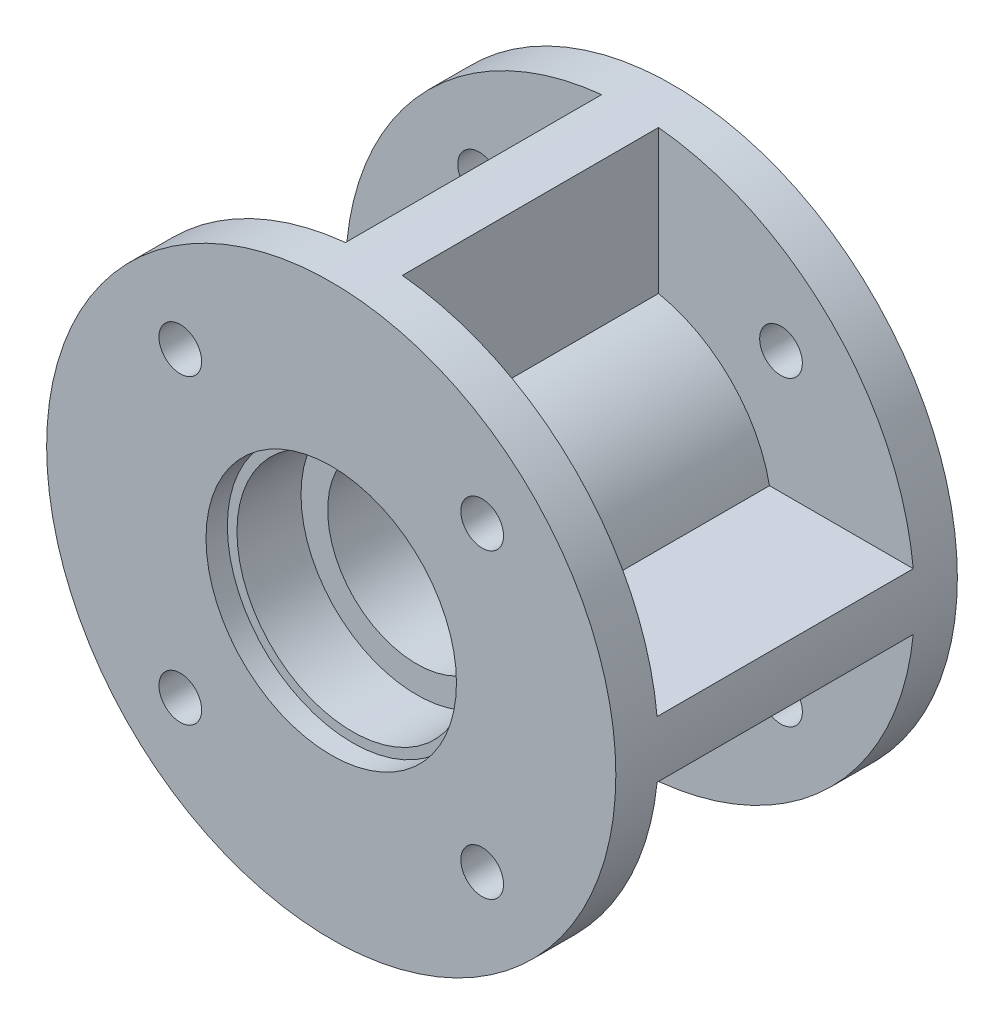
ISO-10303-21;
HEADER;
FILE_DESCRIPTION(('STEP AP214'),'2;1');
FILE_NAME('part.step','',(''),(''),'','','');
FILE_SCHEMA(('AUTOMOTIVE_DESIGN { 1 0 10303 214 1 1 1 1 }'));
ENDSEC;
DATA;
#1=APPLICATION_CONTEXT('core data for automotive mechanical design processes');
#2=APPLICATION_PROTOCOL_DEFINITION('international standard','automotive_design',2000,#1);
#3=PRODUCT_CONTEXT('',#1,'mechanical');
#4=PRODUCT('Part','Part','',(#3));
#5=PRODUCT_RELATED_PRODUCT_CATEGORY('part','',(#4));
#6=PRODUCT_DEFINITION_FORMATION('','',#4);
#7=PRODUCT_DEFINITION_CONTEXT('part definition',#1,'design');
#8=PRODUCT_DEFINITION('design','',#6,#7);
#9=PRODUCT_DEFINITION_SHAPE('','',#8);
#10=(LENGTH_UNIT() NAMED_UNIT(*) SI_UNIT(.MILLI.,.METRE.));
#11=(NAMED_UNIT(*) PLANE_ANGLE_UNIT() SI_UNIT($,.RADIAN.));
#12=(NAMED_UNIT(*) SI_UNIT($,.STERADIAN.) SOLID_ANGLE_UNIT());
#13=UNCERTAINTY_MEASURE_WITH_UNIT(LENGTH_MEASURE(1.E-05),#10,'distance_accuracy_value','');
#14=(GEOMETRIC_REPRESENTATION_CONTEXT(3) GLOBAL_UNCERTAINTY_ASSIGNED_CONTEXT((#13)) GLOBAL_UNIT_ASSIGNED_CONTEXT((#10,
#11,#12)) REPRESENTATION_CONTEXT('',''));
#15=CARTESIAN_POINT('',(0.,0.,0.));
#16=DIRECTION('',(0.,0.,1.));
#17=DIRECTION('',(1.,0.,0.));
#18=AXIS2_PLACEMENT_3D('',#15,#16,#17);
#19=CARTESIAN_POINT('',(0.,0.,36.));
#20=DIRECTION('',(0.,0.,-1.));
#21=DIRECTION('',(-1.,0.,0.));
#22=AXIS2_PLACEMENT_3D('',#19,#20,#21);
#23=CYLINDRICAL_SURFACE('',#22,20.);
#24=CARTESIAN_POINT('',(0.,0.,42.));
#25=DIRECTION('',(0.,0.,1.));
#26=DIRECTION('',(1.,0.,0.));
#27=AXIS2_PLACEMENT_3D('',#24,#25,#26);
#28=CIRCLE('',#27,20.);
#29=CARTESIAN_POINT('',(19.5959179422654,4.,42.));
#30=VERTEX_POINT('',#29);
#31=CARTESIAN_POINT('',(4.00000000000021,19.5959179422654,42.));
#32=VERTEX_POINT('',#31);
#33=EDGE_CURVE('E168',#30,#32,#28,.T.);
#34=ORIENTED_EDGE('',*,*,#33,.F.);
#35=DIRECTION('',(0.,0.,-1.));
#36=VECTOR('',#35,1.);
#37=CARTESIAN_POINT('',(19.5959179422654,4.,69.9163538166998));
#38=LINE('',#37,#36);
#39=CARTESIAN_POINT('',(19.5959179422654,4.,6.));
#40=VERTEX_POINT('',#39);
#41=EDGE_CURVE('E182',#30,#40,#38,.T.);
#42=ORIENTED_EDGE('',*,*,#41,.T.);
#43=CARTESIAN_POINT('',(0.,0.,6.));
#44=DIRECTION('',(0.,0.,1.));
#45=DIRECTION('',(1.,0.,0.));
#46=AXIS2_PLACEMENT_3D('',#43,#44,#45);
#47=CIRCLE('',#46,20.);
#48=CARTESIAN_POINT('',(4.00000000000021,19.5959179422654,6.));
#49=VERTEX_POINT('',#48);
#50=EDGE_CURVE('E254',#40,#49,#47,.T.);
#51=ORIENTED_EDGE('',*,*,#50,.T.);
#52=DIRECTION('',(0.,0.,-1.));
#53=VECTOR('',#52,1.);
#54=CARTESIAN_POINT('',(4.00000000000021,19.5959179422654,69.9163538166998));
#55=LINE('',#54,#53);
#56=EDGE_CURVE('E184',#32,#49,#55,.T.);
#57=ORIENTED_EDGE('',*,*,#56,.F.);
#58=EDGE_LOOP('',(#34,#42,#51,#57));
#59=FACE_BOUND('',#58,.T.);
#60=ADVANCED_FACE('F54',(#59),#23,.T.);
#61=CARTESIAN_POINT('',(-3.99999999999979,19.5959179422655,42.));
#62=VERTEX_POINT('',#61);
#63=CARTESIAN_POINT('',(-19.5959179422654,4.00000000000014,42.));
#64=VERTEX_POINT('',#63);
#65=EDGE_CURVE('E187',#62,#64,#28,.T.);
#66=ORIENTED_EDGE('',*,*,#65,.F.);
#67=DIRECTION('',(0.,0.,-1.));
#68=VECTOR('',#67,1.);
#69=CARTESIAN_POINT('',(-3.99999999999979,19.5959179422655,69.9163538166998));
#70=LINE('',#69,#68);
#71=CARTESIAN_POINT('',(-3.99999999999979,19.5959179422655,6.));
#72=VERTEX_POINT('',#71);
#73=EDGE_CURVE('E346',#62,#72,#70,.T.);
#74=ORIENTED_EDGE('',*,*,#73,.T.);
#75=CARTESIAN_POINT('',(-19.5959179422654,4.00000000000014,6.));
#76=VERTEX_POINT('',#75);
#77=EDGE_CURVE('E255',#72,#76,#47,.T.);
#78=ORIENTED_EDGE('',*,*,#77,.T.);
#79=DIRECTION('',(0.,0.,-1.));
#80=VECTOR('',#79,1.);
#81=CARTESIAN_POINT('',(-19.5959179422654,4.00000000000014,69.9163538166998));
#82=LINE('',#81,#80);
#83=EDGE_CURVE('E366',#64,#76,#82,.T.);
#84=ORIENTED_EDGE('',*,*,#83,.F.);
#85=EDGE_LOOP('',(#66,#74,#78,#84));
#86=FACE_BOUND('',#85,.T.);
#87=ADVANCED_FACE('F486',(#86),#23,.T.);
#88=CARTESIAN_POINT('',(-19.5959179422655,-3.99999999999986,42.));
#89=VERTEX_POINT('',#88);
#90=CARTESIAN_POINT('',(-4.00000000000007,-19.5959179422654,42.));
#91=VERTEX_POINT('',#90);
#92=EDGE_CURVE('E507',#89,#91,#28,.T.);
#93=ORIENTED_EDGE('',*,*,#92,.F.);
#94=DIRECTION('',(0.,0.,-1.));
#95=VECTOR('',#94,1.);
#96=CARTESIAN_POINT('',(-19.5959179422655,-3.99999999999986,69.9163538166998));
#97=LINE('',#96,#95);
#98=CARTESIAN_POINT('',(-19.5959179422655,-3.99999999999986,6.));
#99=VERTEX_POINT('',#98);
#100=EDGE_CURVE('E220',#89,#99,#97,.T.);
#101=ORIENTED_EDGE('',*,*,#100,.T.);
#102=CARTESIAN_POINT('',(-4.00000000000007,-19.5959179422654,6.));
#103=VERTEX_POINT('',#102);
#104=EDGE_CURVE('E248',#99,#103,#47,.T.);
#105=ORIENTED_EDGE('',*,*,#104,.T.);
#106=DIRECTION('',(0.,0.,-1.));
#107=VECTOR('',#106,1.);
#108=CARTESIAN_POINT('',(-4.00000000000007,-19.5959179422654,69.9163538166998));
#109=LINE('',#108,#107);
#110=EDGE_CURVE('E201',#91,#103,#109,.T.);
#111=ORIENTED_EDGE('',*,*,#110,.F.);
#112=EDGE_LOOP('',(#93,#101,#105,#111));
#113=FACE_BOUND('',#112,.T.);
#114=ADVANCED_FACE('F417',(#113),#23,.T.);
#115=CARTESIAN_POINT('',(3.99999999999993,-19.5959179422654,42.));
#116=VERTEX_POINT('',#115);
#117=CARTESIAN_POINT('',(19.5959179422654,-4.,42.));
#118=VERTEX_POINT('',#117);
#119=EDGE_CURVE('E189',#116,#118,#28,.T.);
#120=ORIENTED_EDGE('',*,*,#119,.F.);
#121=DIRECTION('',(0.,0.,-1.));
#122=VECTOR('',#121,1.);
#123=CARTESIAN_POINT('',(3.99999999999993,-19.5959179422654,69.9163538166998));
#124=LINE('',#123,#122);
#125=CARTESIAN_POINT('',(3.99999999999993,-19.5959179422654,6.));
#126=VERTEX_POINT('',#125);
#127=EDGE_CURVE('E195',#116,#126,#124,.T.);
#128=ORIENTED_EDGE('',*,*,#127,.T.);
#129=CARTESIAN_POINT('',(19.5959179422654,-4.,6.));
#130=VERTEX_POINT('',#129);
#131=EDGE_CURVE('E249',#126,#130,#47,.T.);
#132=ORIENTED_EDGE('',*,*,#131,.T.);
#133=DIRECTION('',(0.,0.,-1.));
#134=VECTOR('',#133,1.);
#135=CARTESIAN_POINT('',(19.5959179422654,-4.,69.9163538166998));
#136=LINE('',#135,#134);
#137=EDGE_CURVE('E196',#118,#130,#136,.T.);
#138=ORIENTED_EDGE('',*,*,#137,.F.);
#139=EDGE_LOOP('',(#120,#128,#132,#138));
#140=FACE_BOUND('',#139,.T.);
#141=ADVANCED_FACE('F488',(#140),#23,.T.);
#142=CARTESIAN_POINT('',(-4.00000000000007,-19.5959179422654,69.9163538166998));
#143=DIRECTION('',(1.,0.,0.));
#144=DIRECTION('',(0.,1.,0.));
#145=AXIS2_PLACEMENT_3D('',#142,#143,#144);
#146=PLANE('',#145);
#147=DIRECTION('',(0.,-1.,0.));
#148=VECTOR('',#147,1.);
#149=CARTESIAN_POINT('',(-4.00000000000007,-19.5959179422654,42.));
#150=LINE('',#149,#148);
#151=CARTESIAN_POINT('',(-4.00000000000014,-39.7994974842648,42.));
#152=VERTEX_POINT('',#151);
#153=EDGE_CURVE('E336',#91,#152,#150,.T.);
#154=ORIENTED_EDGE('',*,*,#153,.F.);
#155=ORIENTED_EDGE('',*,*,#110,.T.);
#156=DIRECTION('',(0.,-1.,0.));
#157=VECTOR('',#156,1.);
#158=CARTESIAN_POINT('',(-4.00000000000007,-19.5959179422654,6.));
#159=LINE('',#158,#157);
#160=CARTESIAN_POINT('',(-4.00000000000015,-39.7994974842648,6.));
#161=VERTEX_POINT('',#160);
#162=EDGE_CURVE('E225',#103,#161,#159,.T.);
#163=ORIENTED_EDGE('',*,*,#162,.T.);
#164=DIRECTION('',(0.,0.,-1.));
#165=VECTOR('',#164,1.);
#166=CARTESIAN_POINT('',(-4.00000000000015,-39.7994974842648,69.9163538166998));
#167=LINE('',#166,#165);
#168=EDGE_CURVE('E229',#152,#161,#167,.T.);
#169=ORIENTED_EDGE('',*,*,#168,.F.);
#170=EDGE_LOOP('',(#154,#155,#163,#169));
#171=FACE_BOUND('',#170,.T.);
#172=ADVANCED_FACE('F412',(#171),#146,.F.);
#173=CARTESIAN_POINT('',(3.99999999999986,-39.7994974842648,69.9163538166998));
#174=DIRECTION('',(-1.,0.,0.));
#175=DIRECTION('',(0.,-1.,0.));
#176=AXIS2_PLACEMENT_3D('',#173,#174,#175);
#177=PLANE('',#176);
#178=DIRECTION('',(0.,1.,0.));
#179=VECTOR('',#178,1.);
#180=CARTESIAN_POINT('',(3.99999999999986,-39.7994974842648,42.));
#181=LINE('',#180,#179);
#182=CARTESIAN_POINT('',(3.99999999999986,-39.7994974842648,42.));
#183=VERTEX_POINT('',#182);
#184=EDGE_CURVE('E333',#183,#116,#181,.T.);
#185=ORIENTED_EDGE('',*,*,#184,.F.);
#186=DIRECTION('',(0.,0.,-1.));
#187=VECTOR('',#186,1.);
#188=CARTESIAN_POINT('',(3.99999999999986,-39.7994974842648,69.9163538166998));
#189=LINE('',#188,#187);
#190=CARTESIAN_POINT('',(3.99999999999986,-39.7994974842648,6.));
#191=VERTEX_POINT('',#190);
#192=EDGE_CURVE('E74',#183,#191,#189,.T.);
#193=ORIENTED_EDGE('',*,*,#192,.T.);
#194=DIRECTION('',(0.,1.,0.));
#195=VECTOR('',#194,1.);
#196=CARTESIAN_POINT('',(3.99999999999986,-39.7994974842648,6.));
#197=LINE('',#196,#195);
#198=EDGE_CURVE('E221',#191,#126,#197,.T.);
#199=ORIENTED_EDGE('',*,*,#198,.T.);
#200=ORIENTED_EDGE('',*,*,#127,.F.);
#201=EDGE_LOOP('',(#185,#193,#199,#200));
#202=FACE_BOUND('',#201,.T.);
#203=ADVANCED_FACE('F499',(#202),#177,.F.);
#204=CARTESIAN_POINT('',(19.5959179422654,-4.,69.9163538166998));
#205=DIRECTION('',(0.,1.,0.));
#206=DIRECTION('',(0.,0.,1.));
#207=AXIS2_PLACEMENT_3D('',#204,#205,#206);
#208=PLANE('',#207);
#209=DIRECTION('',(1.,0.,0.));
#210=VECTOR('',#209,1.);
#211=CARTESIAN_POINT('',(19.5959179422654,-4.,42.));
#212=LINE('',#211,#210);
#213=CARTESIAN_POINT('',(39.7994974842648,-4.,42.));
#214=VERTEX_POINT('',#213);
#215=EDGE_CURVE('E176',#118,#214,#212,.T.);
#216=ORIENTED_EDGE('',*,*,#215,.F.);
#217=ORIENTED_EDGE('',*,*,#137,.T.);
#218=DIRECTION('',(1.,0.,0.));
#219=VECTOR('',#218,1.);
#220=CARTESIAN_POINT('',(19.5959179422654,-4.,6.));
#221=LINE('',#220,#219);
#222=CARTESIAN_POINT('',(39.7994974842648,-4.00000000000001,6.));
#223=VERTEX_POINT('',#222);
#224=EDGE_CURVE('E203',#130,#223,#221,.T.);
#225=ORIENTED_EDGE('',*,*,#224,.T.);
#226=DIRECTION('',(0.,0.,-1.));
#227=VECTOR('',#226,1.);
#228=CARTESIAN_POINT('',(39.7994974842648,-4.00000000000001,69.9163538166998));
#229=LINE('',#228,#227);
#230=EDGE_CURVE('E212',#214,#223,#229,.T.);
#231=ORIENTED_EDGE('',*,*,#230,.F.);
#232=EDGE_LOOP('',(#216,#217,#225,#231));
#233=FACE_BOUND('',#232,.T.);
#234=ADVANCED_FACE('F514',(#233),#208,.F.);
#235=CARTESIAN_POINT('',(39.7994974842648,4.,69.9163538166998));
#236=DIRECTION('',(0.,-1.,0.));
#237=DIRECTION('',(0.,0.,-1.));
#238=AXIS2_PLACEMENT_3D('',#235,#236,#237);
#239=PLANE('',#238);
#240=DIRECTION('',(-1.,0.,0.));
#241=VECTOR('',#240,1.);
#242=CARTESIAN_POINT('',(39.7994974842648,4.,42.));
#243=LINE('',#242,#241);
#244=CARTESIAN_POINT('',(39.7994974842648,4.,42.));
#245=VERTEX_POINT('',#244);
#246=EDGE_CURVE('E165',#245,#30,#243,.T.);
#247=ORIENTED_EDGE('',*,*,#246,.F.);
#248=DIRECTION('',(0.,0.,-1.));
#249=VECTOR('',#248,1.);
#250=CARTESIAN_POINT('',(39.7994974842648,4.,69.9163538166998));
#251=LINE('',#250,#249);
#252=CARTESIAN_POINT('',(39.7994974842648,4.,6.));
#253=VERTEX_POINT('',#252);
#254=EDGE_CURVE('E209',#245,#253,#251,.T.);
#255=ORIENTED_EDGE('',*,*,#254,.T.);
#256=DIRECTION('',(-1.,0.,0.));
#257=VECTOR('',#256,1.);
#258=CARTESIAN_POINT('',(39.7994974842648,4.,6.));
#259=LINE('',#258,#257);
#260=EDGE_CURVE('E192',#253,#40,#259,.T.);
#261=ORIENTED_EDGE('',*,*,#260,.T.);
#262=ORIENTED_EDGE('',*,*,#41,.F.);
#263=EDGE_LOOP('',(#247,#255,#261,#262));
#264=FACE_BOUND('',#263,.T.);
#265=ADVANCED_FACE('F190',(#264),#239,.F.);
#266=CARTESIAN_POINT('',(-19.5959179422654,4.00000000000014,69.9163538166998));
#267=DIRECTION('',(0.,-1.,0.));
#268=DIRECTION('',(1.,0.,0.));
#269=AXIS2_PLACEMENT_3D('',#266,#267,#268);
#270=PLANE('',#269);
#271=DIRECTION('',(-1.,0.,0.));
#272=VECTOR('',#271,1.);
#273=CARTESIAN_POINT('',(-19.5959179422654,4.00000000000014,42.));
#274=LINE('',#273,#272);
#275=CARTESIAN_POINT('',(-39.7994974842648,4.00000000000028,42.));
#276=VERTEX_POINT('',#275);
#277=EDGE_CURVE('E177',#64,#276,#274,.T.);
#278=ORIENTED_EDGE('',*,*,#277,.F.);
#279=ORIENTED_EDGE('',*,*,#83,.T.);
#280=DIRECTION('',(-1.,0.,0.));
#281=VECTOR('',#280,1.);
#282=CARTESIAN_POINT('',(-19.5959179422654,4.00000000000014,6.));
#283=LINE('',#282,#281);
#284=CARTESIAN_POINT('',(-39.7994974842648,4.00000000000029,6.));
#285=VERTEX_POINT('',#284);
#286=EDGE_CURVE('E373',#76,#285,#283,.T.);
#287=ORIENTED_EDGE('',*,*,#286,.T.);
#288=DIRECTION('',(0.,0.,-1.));
#289=VECTOR('',#288,1.);
#290=CARTESIAN_POINT('',(-39.7994974842648,4.00000000000029,69.9163538166998));
#291=LINE('',#290,#289);
#292=EDGE_CURVE('E370',#276,#285,#291,.T.);
#293=ORIENTED_EDGE('',*,*,#292,.F.);
#294=EDGE_LOOP('',(#278,#279,#287,#293));
#295=FACE_BOUND('',#294,.T.);
#296=ADVANCED_FACE('F382',(#295),#270,.F.);
#297=CARTESIAN_POINT('',(-39.7994974842648,-3.99999999999972,69.9163538166998));
#298=DIRECTION('',(0.,1.,0.));
#299=DIRECTION('',(-1.,0.,0.));
#300=AXIS2_PLACEMENT_3D('',#297,#298,#299);
#301=PLANE('',#300);
#302=DIRECTION('',(1.,0.,0.));
#303=VECTOR('',#302,1.);
#304=CARTESIAN_POINT('',(-39.7994974842648,-3.99999999999972,42.));
#305=LINE('',#304,#303);
#306=CARTESIAN_POINT('',(-39.7994974842648,-3.99999999999972,42.));
#307=VERTEX_POINT('',#306);
#308=EDGE_CURVE('E326',#307,#89,#305,.T.);
#309=ORIENTED_EDGE('',*,*,#308,.F.);
#310=DIRECTION('',(0.,0.,-1.));
#311=VECTOR('',#310,1.);
#312=CARTESIAN_POINT('',(-39.7994974842648,-3.99999999999972,69.9163538166998));
#313=LINE('',#312,#311);
#314=CARTESIAN_POINT('',(-39.7994974842648,-3.99999999999972,6.));
#315=VERTEX_POINT('',#314);
#316=EDGE_CURVE('E367',#307,#315,#313,.T.);
#317=ORIENTED_EDGE('',*,*,#316,.T.);
#318=DIRECTION('',(1.,0.,0.));
#319=VECTOR('',#318,1.);
#320=CARTESIAN_POINT('',(-39.7994974842648,-3.99999999999972,6.));
#321=LINE('',#320,#319);
#322=EDGE_CURVE('E207',#315,#99,#321,.T.);
#323=ORIENTED_EDGE('',*,*,#322,.T.);
#324=ORIENTED_EDGE('',*,*,#100,.F.);
#325=EDGE_LOOP('',(#309,#317,#323,#324));
#326=FACE_BOUND('',#325,.T.);
#327=ADVANCED_FACE('F540',(#326),#301,.F.);
#328=CARTESIAN_POINT('',(4.00000000000021,19.5959179422654,69.9163538166998));
#329=DIRECTION('',(-1.,0.,0.));
#330=DIRECTION('',(0.,-1.,0.));
#331=AXIS2_PLACEMENT_3D('',#328,#329,#330);
#332=PLANE('',#331);
#333=DIRECTION('',(0.,1.,0.));
#334=VECTOR('',#333,1.);
#335=CARTESIAN_POINT('',(4.00000000000021,19.5959179422654,42.));
#336=LINE('',#335,#334);
#337=CARTESIAN_POINT('',(4.00000000000042,39.7994974842648,42.));
#338=VERTEX_POINT('',#337);
#339=EDGE_CURVE('E322',#32,#338,#336,.T.);
#340=ORIENTED_EDGE('',*,*,#339,.F.);
#341=ORIENTED_EDGE('',*,*,#56,.T.);
#342=DIRECTION('',(0.,1.,0.));
#343=VECTOR('',#342,1.);
#344=CARTESIAN_POINT('',(4.00000000000021,19.5959179422654,6.));
#345=LINE('',#344,#343);
#346=CARTESIAN_POINT('',(4.00000000000042,39.7994974842648,6.));
#347=VERTEX_POINT('',#346);
#348=EDGE_CURVE('E355',#49,#347,#345,.T.);
#349=ORIENTED_EDGE('',*,*,#348,.T.);
#350=DIRECTION('',(0.,0.,-1.));
#351=VECTOR('',#350,1.);
#352=CARTESIAN_POINT('',(4.00000000000042,39.7994974842648,69.9163538166998));
#353=LINE('',#352,#351);
#354=EDGE_CURVE('E352',#338,#347,#353,.T.);
#355=ORIENTED_EDGE('',*,*,#354,.F.);
#356=EDGE_LOOP('',(#340,#341,#349,#355));
#357=FACE_BOUND('',#356,.T.);
#358=ADVANCED_FACE('F430',(#357),#332,.F.);
#359=CARTESIAN_POINT('',(-3.99999999999958,39.7994974842648,69.9163538166998));
#360=DIRECTION('',(1.,0.,0.));
#361=DIRECTION('',(0.,1.,0.));
#362=AXIS2_PLACEMENT_3D('',#359,#360,#361);
#363=PLANE('',#362);
#364=DIRECTION('',(0.,-1.,0.));
#365=VECTOR('',#364,1.);
#366=CARTESIAN_POINT('',(-3.99999999999958,39.7994974842648,42.));
#367=LINE('',#366,#365);
#368=CARTESIAN_POINT('',(-3.99999999999958,39.7994974842648,42.));
#369=VERTEX_POINT('',#368);
#370=EDGE_CURVE('E12',#369,#62,#367,.T.);
#371=ORIENTED_EDGE('',*,*,#370,.F.);
#372=DIRECTION('',(0.,0.,-1.));
#373=VECTOR('',#372,1.);
#374=CARTESIAN_POINT('',(-3.99999999999958,39.7994974842648,69.9163538166998));
#375=LINE('',#374,#373);
#376=CARTESIAN_POINT('',(-3.99999999999958,39.7994974842648,6.));
#377=VERTEX_POINT('',#376);
#378=EDGE_CURVE('E349',#369,#377,#375,.T.);
#379=ORIENTED_EDGE('',*,*,#378,.T.);
#380=DIRECTION('',(0.,-1.,0.));
#381=VECTOR('',#380,1.);
#382=CARTESIAN_POINT('',(-3.99999999999958,39.7994974842648,6.));
#383=LINE('',#382,#381);
#384=EDGE_CURVE('E272',#377,#72,#383,.T.);
#385=ORIENTED_EDGE('',*,*,#384,.T.);
#386=ORIENTED_EDGE('',*,*,#73,.F.);
#387=EDGE_LOOP('',(#371,#379,#385,#386));
#388=FACE_BOUND('',#387,.T.);
#389=ADVANCED_FACE('F461',(#388),#363,.F.);
#390=CARTESIAN_POINT('',(0.,0.,48.));
#391=DIRECTION('',(0.,0.,-1.));
#392=DIRECTION('',(-1.,0.,0.));
#393=AXIS2_PLACEMENT_3D('',#390,#391,#392);
#394=CYLINDRICAL_SURFACE('',#393,16.25);
#395=CARTESIAN_POINT('',(0.,0.,36.));
#396=DIRECTION('',(0.,0.,1.));
#397=DIRECTION('',(1.,0.,0.));
#398=AXIS2_PLACEMENT_3D('',#395,#396,#397);
#399=CIRCLE('',#398,16.25);
#400=CARTESIAN_POINT('',(16.25,0.,36.));
#401=VERTEX_POINT('',#400);
#402=EDGE_CURVE('E233',#401,#401,#399,.T.);
#403=ORIENTED_EDGE('',*,*,#402,.F.);
#404=EDGE_LOOP('',(#403));
#405=FACE_BOUND('',#404,.T.);
#406=CARTESIAN_POINT('',(0.,0.,45.));
#407=DIRECTION('',(0.,0.,1.));
#408=DIRECTION('',(1.,0.,0.));
#409=AXIS2_PLACEMENT_3D('',#406,#407,#408);
#410=CIRCLE('',#409,16.25);
#411=CARTESIAN_POINT('',(16.25,0.,45.));
#412=VERTEX_POINT('',#411);
#413=EDGE_CURVE('E269',#412,#412,#410,.T.);
#414=ORIENTED_EDGE('',*,*,#413,.T.);
#415=EDGE_LOOP('',(#414));
#416=FACE_BOUND('',#415,.T.);
#417=ADVANCED_FACE('F458',(#405,#416),#394,.F.);
#418=CARTESIAN_POINT('',(0.,0.,6.));
#419=DIRECTION('',(0.,0.,1.));
#420=DIRECTION('',(1.,0.,0.));
#421=AXIS2_PLACEMENT_3D('',#418,#419,#420);
#422=PLANE('',#421);
#423=CARTESIAN_POINT('',(21.2132034355965,21.2132034355963,6.00000000000001));
#424=DIRECTION('',(0.,0.,1.));
#425=DIRECTION('',(1.,0.,0.));
#426=AXIS2_PLACEMENT_3D('',#423,#424,#425);
#427=CIRCLE('',#426,3.);
#428=CARTESIAN_POINT('',(24.2132034355965,21.2132034355963,6.00000000000001));
#429=VERTEX_POINT('',#428);
#430=EDGE_CURVE('E297',#429,#429,#427,.T.);
#431=ORIENTED_EDGE('',*,*,#430,.F.);
#432=EDGE_LOOP('',(#431));
#433=FACE_BOUND('',#432,.T.);
#434=CARTESIAN_POINT('',(0.,0.,6.));
#435=DIRECTION('',(0.,0.,1.));
#436=DIRECTION('',(1.,0.,0.));
#437=AXIS2_PLACEMENT_3D('',#434,#435,#436);
#438=CIRCLE('',#437,40.);
#439=EDGE_CURVE('E263',#253,#347,#438,.T.);
#440=ORIENTED_EDGE('',*,*,#439,.T.);
#441=ORIENTED_EDGE('',*,*,#348,.F.);
#442=ORIENTED_EDGE('',*,*,#50,.F.);
#443=ORIENTED_EDGE('',*,*,#260,.F.);
#444=EDGE_LOOP('',(#440,#441,#442,#443));
#445=FACE_BOUND('',#444,.T.);
#446=ADVANCED_FACE('F426',(#433,#445),#422,.T.);
#447=CARTESIAN_POINT('',(-21.2132034355964,21.2132034355965,6.00000000000001));
#448=DIRECTION('',(0.,0.,1.));
#449=DIRECTION('',(1.,0.,0.));
#450=AXIS2_PLACEMENT_3D('',#447,#448,#449);
#451=CIRCLE('',#450,3.);
#452=CARTESIAN_POINT('',(-18.2132034355964,21.2132034355965,6.00000000000001));
#453=VERTEX_POINT('',#452);
#454=EDGE_CURVE('E316',#453,#453,#451,.T.);
#455=ORIENTED_EDGE('',*,*,#454,.F.);
#456=EDGE_LOOP('',(#455));
#457=FACE_BOUND('',#456,.T.);
#458=ORIENTED_EDGE('',*,*,#77,.F.);
#459=ORIENTED_EDGE('',*,*,#384,.F.);
#460=EDGE_CURVE('E264',#377,#285,#438,.T.);
#461=ORIENTED_EDGE('',*,*,#460,.T.);
#462=ORIENTED_EDGE('',*,*,#286,.F.);
#463=EDGE_LOOP('',(#458,#459,#461,#462));
#464=FACE_BOUND('',#463,.T.);
#465=ADVANCED_FACE('F388',(#457,#464),#422,.T.);
#466=CARTESIAN_POINT('',(-21.2132034355964,-21.2132034355965,6.00000000000001));
#467=DIRECTION('',(0.,0.,1.));
#468=DIRECTION('',(1.,0.,0.));
#469=AXIS2_PLACEMENT_3D('',#466,#467,#468);
#470=CIRCLE('',#469,3.);
#471=CARTESIAN_POINT('',(-18.2132034355964,-21.2132034355965,6.00000000000001));
#472=VERTEX_POINT('',#471);
#473=EDGE_CURVE('E290',#472,#472,#470,.T.);
#474=ORIENTED_EDGE('',*,*,#473,.F.);
#475=EDGE_LOOP('',(#474));
#476=FACE_BOUND('',#475,.T.);
#477=ORIENTED_EDGE('',*,*,#104,.F.);
#478=ORIENTED_EDGE('',*,*,#322,.F.);
#479=EDGE_CURVE('E268',#315,#161,#438,.T.);
#480=ORIENTED_EDGE('',*,*,#479,.T.);
#481=ORIENTED_EDGE('',*,*,#162,.F.);
#482=EDGE_LOOP('',(#477,#478,#480,#481));
#483=FACE_BOUND('',#482,.T.);
#484=ADVANCED_FACE('F405',(#476,#483),#422,.T.);
#485=CARTESIAN_POINT('',(21.2132034355965,-21.2132034355963,6.00000000000001));
#486=DIRECTION('',(0.,0.,1.));
#487=DIRECTION('',(1.,0.,0.));
#488=AXIS2_PLACEMENT_3D('',#485,#486,#487);
#489=CIRCLE('',#488,3.);
#490=CARTESIAN_POINT('',(24.2132034355965,-21.2132034355963,6.00000000000001));
#491=VERTEX_POINT('',#490);
#492=EDGE_CURVE('E285',#491,#491,#489,.T.);
#493=ORIENTED_EDGE('',*,*,#492,.F.);
#494=EDGE_LOOP('',(#493));
#495=FACE_BOUND('',#494,.T.);
#496=EDGE_CURVE('E65',#191,#223,#438,.T.);
#497=ORIENTED_EDGE('',*,*,#496,.T.);
#498=ORIENTED_EDGE('',*,*,#224,.F.);
#499=ORIENTED_EDGE('',*,*,#131,.F.);
#500=ORIENTED_EDGE('',*,*,#198,.F.);
#501=EDGE_LOOP('',(#497,#498,#499,#500));
#502=FACE_BOUND('',#501,.T.);
#503=ADVANCED_FACE('F454',(#495,#502),#422,.T.);
#504=CARTESIAN_POINT('',(0.,0.,36.));
#505=DIRECTION('',(0.,0.,1.));
#506=DIRECTION('',(1.,0.,0.));
#507=AXIS2_PLACEMENT_3D('',#504,#505,#506);
#508=PLANE('',#507);
#509=CARTESIAN_POINT('',(0.,0.,36.));
#510=DIRECTION('',(0.,0.,1.));
#511=DIRECTION('',(1.,0.,0.));
#512=AXIS2_PLACEMENT_3D('',#509,#510,#511);
#513=CIRCLE('',#512,12.5);
#514=CARTESIAN_POINT('',(12.5,0.,36.));
#515=VERTEX_POINT('',#514);
#516=EDGE_CURVE('E244',#515,#515,#513,.T.);
#517=ORIENTED_EDGE('',*,*,#516,.F.);
#518=EDGE_LOOP('',(#517));
#519=FACE_BOUND('',#518,.T.);
#520=ORIENTED_EDGE('',*,*,#402,.T.);
#521=EDGE_LOOP('',(#520));
#522=FACE_BOUND('',#521,.T.);
#523=ADVANCED_FACE('F442',(#519,#522),#508,.T.);
#524=CARTESIAN_POINT('',(0.,0.,0.));
#525=DIRECTION('',(0.,0.,1.));
#526=DIRECTION('',(1.,0.,0.));
#527=AXIS2_PLACEMENT_3D('',#524,#525,#526);
#528=PLANE('',#527);
#529=CARTESIAN_POINT('',(21.2132034355965,-21.2132034355963,0.));
#530=DIRECTION('',(0.,0.,-1.));
#531=DIRECTION('',(-1.,0.,0.));
#532=AXIS2_PLACEMENT_3D('',#529,#530,#531);
#533=CIRCLE('',#532,3.);
#534=CARTESIAN_POINT('',(18.2132034355965,-21.2132034355963,0.));
#535=VERTEX_POINT('',#534);
#536=EDGE_CURVE('E579',#535,#535,#533,.T.);
#537=ORIENTED_EDGE('',*,*,#536,.F.);
#538=EDGE_LOOP('',(#537));
#539=FACE_BOUND('',#538,.T.);
#540=CARTESIAN_POINT('',(-21.2132034355964,-21.2132034355965,0.));
#541=DIRECTION('',(0.,0.,-1.));
#542=DIRECTION('',(-1.,0.,0.));
#543=AXIS2_PLACEMENT_3D('',#540,#541,#542);
#544=CIRCLE('',#543,3.);
#545=CARTESIAN_POINT('',(-24.2132034355964,-21.2132034355965,0.));
#546=VERTEX_POINT('',#545);
#547=EDGE_CURVE('E583',#546,#546,#544,.T.);
#548=ORIENTED_EDGE('',*,*,#547,.F.);
#549=EDGE_LOOP('',(#548));
#550=FACE_BOUND('',#549,.T.);
#551=CARTESIAN_POINT('',(-21.2132034355964,21.2132034355965,0.));
#552=DIRECTION('',(0.,0.,-1.));
#553=DIRECTION('',(-1.,0.,0.));
#554=AXIS2_PLACEMENT_3D('',#551,#552,#553);
#555=CIRCLE('',#554,3.);
#556=CARTESIAN_POINT('',(-24.2132034355964,21.2132034355965,0.));
#557=VERTEX_POINT('',#556);
#558=EDGE_CURVE('E604',#557,#557,#555,.T.);
#559=ORIENTED_EDGE('',*,*,#558,.F.);
#560=EDGE_LOOP('',(#559));
#561=FACE_BOUND('',#560,.T.);
#562=CARTESIAN_POINT('',(21.2132034355965,21.2132034355963,0.));
#563=DIRECTION('',(0.,0.,-1.));
#564=DIRECTION('',(-1.,0.,0.));
#565=AXIS2_PLACEMENT_3D('',#562,#563,#564);
#566=CIRCLE('',#565,3.);
#567=CARTESIAN_POINT('',(18.2132034355965,21.2132034355963,0.));
#568=VERTEX_POINT('',#567);
#569=EDGE_CURVE('E280',#568,#568,#566,.T.);
#570=ORIENTED_EDGE('',*,*,#569,.F.);
#571=EDGE_LOOP('',(#570));
#572=FACE_BOUND('',#571,.T.);
#573=CARTESIAN_POINT('',(0.,0.,0.));
#574=DIRECTION('',(0.,0.,1.));
#575=DIRECTION('',(1.,0.,0.));
#576=AXIS2_PLACEMENT_3D('',#573,#574,#575);
#577=CIRCLE('',#576,40.);
#578=CARTESIAN_POINT('',(40.,0.,0.));
#579=VERTEX_POINT('',#578);
#580=EDGE_CURVE('E259',#579,#579,#577,.T.);
#581=ORIENTED_EDGE('',*,*,#580,.F.);
#582=EDGE_LOOP('',(#581));
#583=FACE_BOUND('',#582,.T.);
#584=CARTESIAN_POINT('',(0.,0.,0.));
#585=DIRECTION('',(0.,0.,1.));
#586=DIRECTION('',(1.,0.,0.));
#587=AXIS2_PLACEMENT_3D('',#584,#585,#586);
#588=CIRCLE('',#587,12.5);
#589=CARTESIAN_POINT('',(12.5,0.,0.));
#590=VERTEX_POINT('',#589);
#591=EDGE_CURVE('E253',#590,#590,#588,.T.);
#592=ORIENTED_EDGE('',*,*,#591,.T.);
#593=EDGE_LOOP('',(#592));
#594=FACE_BOUND('',#593,.T.);
#595=ADVANCED_FACE('F435',(#539,#550,#561,#572,#583,#594),#528,.F.);
#596=CARTESIAN_POINT('',(0.,0.,6.));
#597=DIRECTION('',(0.,0.,-1.));
#598=DIRECTION('',(-1.,0.,0.));
#599=AXIS2_PLACEMENT_3D('',#596,#597,#598);
#600=CYLINDRICAL_SURFACE('',#599,40.);
#601=ORIENTED_EDGE('',*,*,#378,.F.);
#602=CARTESIAN_POINT('',(0.,0.,42.));
#603=DIRECTION('',(0.,0.,1.));
#604=DIRECTION('',(1.,0.,0.));
#605=AXIS2_PLACEMENT_3D('',#602,#603,#604);
#606=CIRCLE('',#605,40.);
#607=EDGE_CURVE('E323',#369,#276,#606,.T.);
#608=ORIENTED_EDGE('',*,*,#607,.T.);
#609=ORIENTED_EDGE('',*,*,#292,.T.);
#610=ORIENTED_EDGE('',*,*,#460,.F.);
#611=EDGE_LOOP('',(#601,#608,#609,#610));
#612=FACE_BOUND('',#611,.T.);
#613=ORIENTED_EDGE('',*,*,#316,.F.);
#614=EDGE_CURVE('E519',#307,#152,#606,.T.);
#615=ORIENTED_EDGE('',*,*,#614,.T.);
#616=ORIENTED_EDGE('',*,*,#168,.T.);
#617=ORIENTED_EDGE('',*,*,#479,.F.);
#618=EDGE_LOOP('',(#613,#615,#616,#617));
#619=FACE_BOUND('',#618,.T.);
#620=ORIENTED_EDGE('',*,*,#192,.F.);
#621=EDGE_CURVE('E186',#183,#214,#606,.T.);
#622=ORIENTED_EDGE('',*,*,#621,.T.);
#623=ORIENTED_EDGE('',*,*,#230,.T.);
#624=ORIENTED_EDGE('',*,*,#496,.F.);
#625=EDGE_LOOP('',(#620,#622,#623,#624));
#626=FACE_BOUND('',#625,.T.);
#627=EDGE_CURVE('E171',#245,#338,#606,.T.);
#628=ORIENTED_EDGE('',*,*,#627,.T.);
#629=ORIENTED_EDGE('',*,*,#354,.T.);
#630=ORIENTED_EDGE('',*,*,#439,.F.);
#631=ORIENTED_EDGE('',*,*,#254,.F.);
#632=EDGE_LOOP('',(#628,#629,#630,#631));
#633=FACE_BOUND('',#632,.T.);
#634=CARTESIAN_POINT('',(0.,0.,48.));
#635=DIRECTION('',(0.,0.,1.));
#636=DIRECTION('',(1.,0.,0.));
#637=AXIS2_PLACEMENT_3D('',#634,#635,#636);
#638=CIRCLE('',#637,40.);
#639=CARTESIAN_POINT('',(40.,0.,48.));
#640=VERTEX_POINT('',#639);
#641=EDGE_CURVE('E224',#640,#640,#638,.T.);
#642=ORIENTED_EDGE('',*,*,#641,.F.);
#643=EDGE_LOOP('',(#642));
#644=FACE_BOUND('',#643,.T.);
#645=ORIENTED_EDGE('',*,*,#580,.T.);
#646=EDGE_LOOP('',(#645));
#647=FACE_BOUND('',#646,.T.);
#648=ADVANCED_FACE('F56',(#612,#619,#626,#633,#644,#647),#600,.T.);
#649=CARTESIAN_POINT('',(0.,0.,6.));
#650=DIRECTION('',(0.,0.,-1.));
#651=DIRECTION('',(-1.,0.,0.));
#652=AXIS2_PLACEMENT_3D('',#649,#650,#651);
#653=CYLINDRICAL_SURFACE('',#652,12.5);
#654=ORIENTED_EDGE('',*,*,#591,.F.);
#655=EDGE_LOOP('',(#654));
#656=FACE_BOUND('',#655,.T.);
#657=ORIENTED_EDGE('',*,*,#516,.T.);
#658=EDGE_LOOP('',(#657));
#659=FACE_BOUND('',#658,.T.);
#660=ADVANCED_FACE('F434',(#656,#659),#653,.F.);
#661=CARTESIAN_POINT('',(0.,0.,48.));
#662=DIRECTION('',(0.,0.,1.));
#663=DIRECTION('',(1.,0.,0.));
#664=AXIS2_PLACEMENT_3D('',#661,#662,#663);
#665=PLANE('',#664);
#666=CARTESIAN_POINT('',(21.2132034355965,-21.2132034355963,48.));
#667=DIRECTION('',(0.,0.,1.));
#668=DIRECTION('',(1.,0.,0.));
#669=AXIS2_PLACEMENT_3D('',#666,#667,#668);
#670=CIRCLE('',#669,3.);
#671=CARTESIAN_POINT('',(24.2132034355965,-21.2132034355963,48.));
#672=VERTEX_POINT('',#671);
#673=EDGE_CURVE('E279',#672,#672,#670,.T.);
#674=ORIENTED_EDGE('',*,*,#673,.F.);
#675=EDGE_LOOP('',(#674));
#676=FACE_BOUND('',#675,.T.);
#677=CARTESIAN_POINT('',(-21.2132034355964,-21.2132034355965,48.));
#678=DIRECTION('',(0.,0.,1.));
#679=DIRECTION('',(1.,0.,0.));
#680=AXIS2_PLACEMENT_3D('',#677,#678,#679);
#681=CIRCLE('',#680,3.);
#682=CARTESIAN_POINT('',(-18.2132034355964,-21.2132034355965,48.));
#683=VERTEX_POINT('',#682);
#684=EDGE_CURVE('E284',#683,#683,#681,.T.);
#685=ORIENTED_EDGE('',*,*,#684,.F.);
#686=EDGE_LOOP('',(#685));
#687=FACE_BOUND('',#686,.T.);
#688=CARTESIAN_POINT('',(-21.2132034355964,21.2132034355965,48.));
#689=DIRECTION('',(0.,0.,1.));
#690=DIRECTION('',(1.,0.,0.));
#691=AXIS2_PLACEMENT_3D('',#688,#689,#690);
#692=CIRCLE('',#691,3.);
#693=CARTESIAN_POINT('',(-18.2132034355964,21.2132034355965,48.));
#694=VERTEX_POINT('',#693);
#695=EDGE_CURVE('E312',#694,#694,#692,.T.);
#696=ORIENTED_EDGE('',*,*,#695,.F.);
#697=EDGE_LOOP('',(#696));
#698=FACE_BOUND('',#697,.T.);
#699=CARTESIAN_POINT('',(21.2132034355965,21.2132034355963,48.));
#700=DIRECTION('',(0.,0.,1.));
#701=DIRECTION('',(1.,0.,0.));
#702=AXIS2_PLACEMENT_3D('',#699,#700,#701);
#703=CIRCLE('',#702,3.);
#704=CARTESIAN_POINT('',(24.2132034355965,21.2132034355963,48.));
#705=VERTEX_POINT('',#704);
#706=EDGE_CURVE('E289',#705,#705,#703,.T.);
#707=ORIENTED_EDGE('',*,*,#706,.F.);
#708=EDGE_LOOP('',(#707));
#709=FACE_BOUND('',#708,.T.);
#710=ORIENTED_EDGE('',*,*,#641,.T.);
#711=EDGE_LOOP('',(#710));
#712=FACE_BOUND('',#711,.T.);
#713=CARTESIAN_POINT('',(0.,0.,48.));
#714=DIRECTION('',(0.,0.,1.));
#715=DIRECTION('',(1.,0.,0.));
#716=AXIS2_PLACEMENT_3D('',#713,#714,#715);
#717=CIRCLE('',#716,17.6);
#718=CARTESIAN_POINT('',(17.6,0.,48.));
#719=VERTEX_POINT('',#718);
#720=EDGE_CURVE('E339',#719,#719,#717,.T.);
#721=ORIENTED_EDGE('',*,*,#720,.F.);
#722=EDGE_LOOP('',(#721));
#723=FACE_BOUND('',#722,.T.);
#724=ADVANCED_FACE('F448',(#676,#687,#698,#709,#712,#723),#665,.T.);
#725=CARTESIAN_POINT('',(0.,0.,45.));
#726=DIRECTION('',(0.,0.,1.));
#727=DIRECTION('',(1.,0.,0.));
#728=AXIS2_PLACEMENT_3D('',#725,#726,#727);
#729=CYLINDRICAL_SURFACE('',#728,17.6);
#730=CARTESIAN_POINT('',(0.,0.,45.));
#731=DIRECTION('',(0.,0.,1.));
#732=DIRECTION('',(1.,0.,0.));
#733=AXIS2_PLACEMENT_3D('',#730,#731,#732);
#734=CIRCLE('',#733,17.6);
#735=CARTESIAN_POINT('',(17.6,0.,45.));
#736=VERTEX_POINT('',#735);
#737=EDGE_CURVE('E273',#736,#736,#734,.T.);
#738=ORIENTED_EDGE('',*,*,#737,.F.);
#739=EDGE_LOOP('',(#738));
#740=FACE_BOUND('',#739,.T.);
#741=ORIENTED_EDGE('',*,*,#720,.T.);
#742=EDGE_LOOP('',(#741));
#743=FACE_BOUND('',#742,.T.);
#744=ADVANCED_FACE('F469',(#740,#743),#729,.F.);
#745=CARTESIAN_POINT('',(0.,0.,45.));
#746=DIRECTION('',(0.,0.,1.));
#747=DIRECTION('',(1.,0.,0.));
#748=AXIS2_PLACEMENT_3D('',#745,#746,#747);
#749=PLANE('',#748);
#750=ORIENTED_EDGE('',*,*,#413,.F.);
#751=EDGE_LOOP('',(#750));
#752=FACE_BOUND('',#751,.T.);
#753=ORIENTED_EDGE('',*,*,#737,.T.);
#754=EDGE_LOOP('',(#753));
#755=FACE_BOUND('',#754,.T.);
#756=ADVANCED_FACE('F465',(#752,#755),#749,.T.);
#757=CARTESIAN_POINT('',(0.,0.,42.));
#758=DIRECTION('',(0.,0.,1.));
#759=DIRECTION('',(1.,0.,0.));
#760=AXIS2_PLACEMENT_3D('',#757,#758,#759);
#761=PLANE('',#760);
#762=CARTESIAN_POINT('',(-21.2132034355964,21.2132034355965,42.));
#763=DIRECTION('',(0.,0.,1.));
#764=DIRECTION('',(1.,0.,0.));
#765=AXIS2_PLACEMENT_3D('',#762,#763,#764);
#766=CIRCLE('',#765,3.);
#767=CARTESIAN_POINT('',(-18.2132034355964,21.2132034355965,42.));
#768=VERTEX_POINT('',#767);
#769=EDGE_CURVE('E58',#768,#768,#766,.T.);
#770=ORIENTED_EDGE('',*,*,#769,.T.);
#771=EDGE_LOOP('',(#770));
#772=FACE_BOUND('',#771,.T.);
#773=ORIENTED_EDGE('',*,*,#65,.T.);
#774=ORIENTED_EDGE('',*,*,#277,.T.);
#775=ORIENTED_EDGE('',*,*,#607,.F.);
#776=ORIENTED_EDGE('',*,*,#370,.T.);
#777=EDGE_LOOP('',(#773,#774,#775,#776));
#778=FACE_BOUND('',#777,.T.);
#779=ADVANCED_FACE('F468',(#772,#778),#761,.F.);
#780=CARTESIAN_POINT('',(21.2132034355965,21.2132034355963,42.));
#781=DIRECTION('',(0.,0.,1.));
#782=DIRECTION('',(1.,0.,0.));
#783=AXIS2_PLACEMENT_3D('',#780,#781,#782);
#784=CIRCLE('',#783,3.);
#785=CARTESIAN_POINT('',(24.2132034355965,21.2132034355963,42.));
#786=VERTEX_POINT('',#785);
#787=EDGE_CURVE('E286',#786,#786,#784,.T.);
#788=ORIENTED_EDGE('',*,*,#787,.T.);
#789=EDGE_LOOP('',(#788));
#790=FACE_BOUND('',#789,.T.);
#791=ORIENTED_EDGE('',*,*,#627,.F.);
#792=ORIENTED_EDGE('',*,*,#246,.T.);
#793=ORIENTED_EDGE('',*,*,#33,.T.);
#794=ORIENTED_EDGE('',*,*,#339,.T.);
#795=EDGE_LOOP('',(#791,#792,#793,#794));
#796=FACE_BOUND('',#795,.T.);
#797=ADVANCED_FACE('F167',(#790,#796),#761,.F.);
#798=CARTESIAN_POINT('',(-21.2132034355964,-21.2132034355965,42.));
#799=DIRECTION('',(0.,0.,1.));
#800=DIRECTION('',(1.,0.,0.));
#801=AXIS2_PLACEMENT_3D('',#798,#799,#800);
#802=CIRCLE('',#801,3.);
#803=CARTESIAN_POINT('',(-18.2132034355964,-21.2132034355965,42.));
#804=VERTEX_POINT('',#803);
#805=EDGE_CURVE('E281',#804,#804,#802,.T.);
#806=ORIENTED_EDGE('',*,*,#805,.T.);
#807=EDGE_LOOP('',(#806));
#808=FACE_BOUND('',#807,.T.);
#809=ORIENTED_EDGE('',*,*,#92,.T.);
#810=ORIENTED_EDGE('',*,*,#153,.T.);
#811=ORIENTED_EDGE('',*,*,#614,.F.);
#812=ORIENTED_EDGE('',*,*,#308,.T.);
#813=EDGE_LOOP('',(#809,#810,#811,#812));
#814=FACE_BOUND('',#813,.T.);
#815=ADVANCED_FACE('F537',(#808,#814),#761,.F.);
#816=CARTESIAN_POINT('',(21.2132034355965,-21.2132034355963,42.));
#817=DIRECTION('',(0.,0.,1.));
#818=DIRECTION('',(1.,0.,0.));
#819=AXIS2_PLACEMENT_3D('',#816,#817,#818);
#820=CIRCLE('',#819,3.);
#821=CARTESIAN_POINT('',(24.2132034355965,-21.2132034355963,42.));
#822=VERTEX_POINT('',#821);
#823=EDGE_CURVE('E275',#822,#822,#820,.T.);
#824=ORIENTED_EDGE('',*,*,#823,.T.);
#825=EDGE_LOOP('',(#824));
#826=FACE_BOUND('',#825,.T.);
#827=ORIENTED_EDGE('',*,*,#621,.F.);
#828=ORIENTED_EDGE('',*,*,#184,.T.);
#829=ORIENTED_EDGE('',*,*,#119,.T.);
#830=ORIENTED_EDGE('',*,*,#215,.T.);
#831=EDGE_LOOP('',(#827,#828,#829,#830));
#832=FACE_BOUND('',#831,.T.);
#833=ADVANCED_FACE('F516',(#826,#832),#761,.F.);
#834=CARTESIAN_POINT('',(21.2132034355965,-21.2132034355963,78.));
#835=DIRECTION('',(0.,0.,-1.));
#836=DIRECTION('',(-1.,0.,0.));
#837=AXIS2_PLACEMENT_3D('',#834,#835,#836);
#838=CYLINDRICAL_SURFACE('',#837,3.);
#839=ORIENTED_EDGE('',*,*,#673,.T.);
#840=EDGE_LOOP('',(#839));
#841=FACE_BOUND('',#840,.T.);
#842=ORIENTED_EDGE('',*,*,#823,.F.);
#843=EDGE_LOOP('',(#842));
#844=FACE_BOUND('',#843,.T.);
#845=ADVANCED_FACE('F673',(#841,#844),#838,.F.);
#846=CARTESIAN_POINT('',(-21.2132034355964,-21.2132034355965,78.));
#847=DIRECTION('',(0.,0.,-1.));
#848=DIRECTION('',(-1.,0.,0.));
#849=AXIS2_PLACEMENT_3D('',#846,#847,#848);
#850=CYLINDRICAL_SURFACE('',#849,3.);
#851=ORIENTED_EDGE('',*,*,#684,.T.);
#852=EDGE_LOOP('',(#851));
#853=FACE_BOUND('',#852,.T.);
#854=ORIENTED_EDGE('',*,*,#805,.F.);
#855=EDGE_LOOP('',(#854));
#856=FACE_BOUND('',#855,.T.);
#857=ADVANCED_FACE('F638',(#853,#856),#850,.F.);
#858=CARTESIAN_POINT('',(21.2132034355965,21.2132034355963,78.));
#859=DIRECTION('',(0.,0.,-1.));
#860=DIRECTION('',(-1.,0.,0.));
#861=AXIS2_PLACEMENT_3D('',#858,#859,#860);
#862=CYLINDRICAL_SURFACE('',#861,3.);
#863=ORIENTED_EDGE('',*,*,#706,.T.);
#864=EDGE_LOOP('',(#863));
#865=FACE_BOUND('',#864,.T.);
#866=ORIENTED_EDGE('',*,*,#787,.F.);
#867=EDGE_LOOP('',(#866));
#868=FACE_BOUND('',#867,.T.);
#869=ADVANCED_FACE('F628',(#865,#868),#862,.F.);
#870=CARTESIAN_POINT('',(-21.2132034355964,21.2132034355965,78.));
#871=DIRECTION('',(0.,0.,-1.));
#872=DIRECTION('',(-1.,0.,0.));
#873=AXIS2_PLACEMENT_3D('',#870,#871,#872);
#874=CYLINDRICAL_SURFACE('',#873,3.);
#875=ORIENTED_EDGE('',*,*,#695,.T.);
#876=EDGE_LOOP('',(#875));
#877=FACE_BOUND('',#876,.T.);
#878=ORIENTED_EDGE('',*,*,#769,.F.);
#879=EDGE_LOOP('',(#878));
#880=FACE_BOUND('',#879,.T.);
#881=ADVANCED_FACE('F625',(#877,#880),#874,.F.);
#882=ORIENTED_EDGE('',*,*,#430,.T.);
#883=EDGE_LOOP('',(#882));
#884=FACE_BOUND('',#883,.T.);
#885=ORIENTED_EDGE('',*,*,#569,.T.);
#886=EDGE_LOOP('',(#885));
#887=FACE_BOUND('',#886,.T.);
#888=ADVANCED_FACE('F627',(#884,#887),#862,.F.);
#889=ORIENTED_EDGE('',*,*,#454,.T.);
#890=EDGE_LOOP('',(#889));
#891=FACE_BOUND('',#890,.T.);
#892=ORIENTED_EDGE('',*,*,#558,.T.);
#893=EDGE_LOOP('',(#892));
#894=FACE_BOUND('',#893,.T.);
#895=ADVANCED_FACE('F631',(#891,#894),#874,.F.);
#896=ORIENTED_EDGE('',*,*,#473,.T.);
#897=EDGE_LOOP('',(#896));
#898=FACE_BOUND('',#897,.T.);
#899=ORIENTED_EDGE('',*,*,#547,.T.);
#900=EDGE_LOOP('',(#899));
#901=FACE_BOUND('',#900,.T.);
#902=ADVANCED_FACE('F642',(#898,#901),#850,.F.);
#903=ORIENTED_EDGE('',*,*,#492,.T.);
#904=EDGE_LOOP('',(#903));
#905=FACE_BOUND('',#904,.T.);
#906=ORIENTED_EDGE('',*,*,#536,.T.);
#907=EDGE_LOOP('',(#906));
#908=FACE_BOUND('',#907,.T.);
#909=ADVANCED_FACE('F647',(#905,#908),#838,.F.);
#910=CLOSED_SHELL('',(#60,#87,#114,#141,#172,#203,#234,#265,#296,#327,#358,#389,#417,#446,#465,
#484,#503,#523,#595,#648,#660,#724,#744,#756,#779,#797,#815,#833,#845,#857,#869,#881,#888,#895,
#902,#909));
#911=MANIFOLD_SOLID_BREP('B2',#910);
#912=ADVANCED_BREP_SHAPE_REPRESENTATION('',(#18,#911),#14);
#913=SHAPE_DEFINITION_REPRESENTATION(#9,#912);
ENDSEC;
END-ISO-10303-21;
